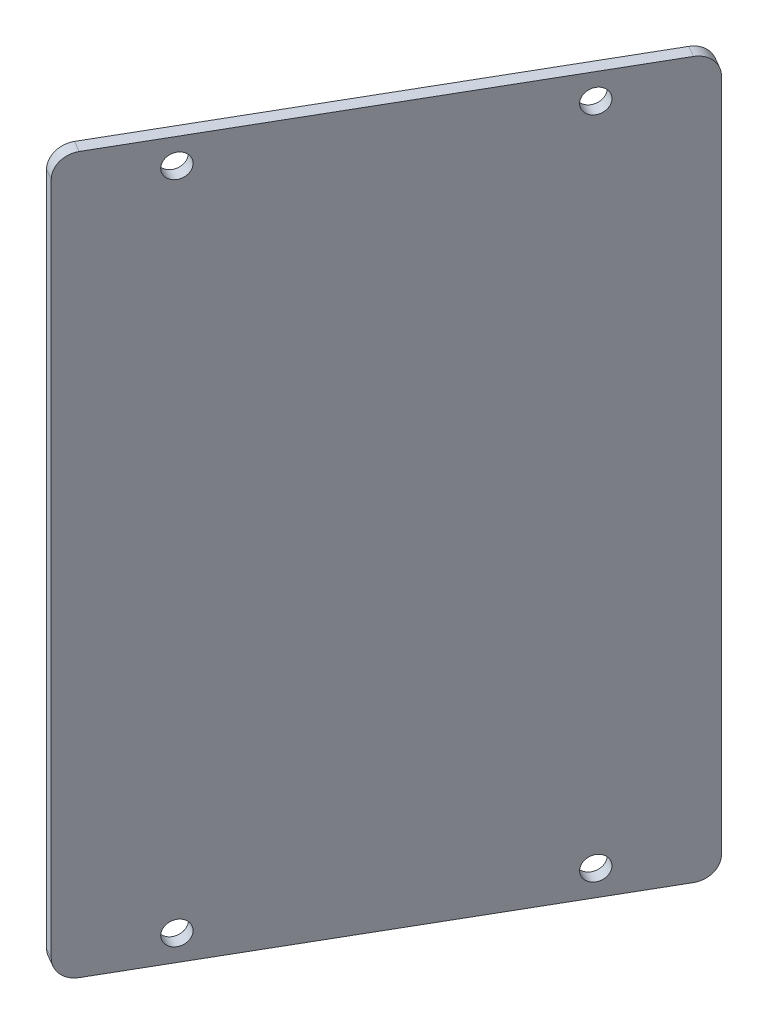
ISO-10303-21;
HEADER;
FILE_DESCRIPTION(('STEP AP214'),'2;1');
FILE_NAME('part.step','',(''),(''),'','','');
FILE_SCHEMA(('AUTOMOTIVE_DESIGN { 1 0 10303 214 1 1 1 1 }'));
ENDSEC;
DATA;
#1=APPLICATION_CONTEXT('core data for automotive mechanical design processes');
#2=APPLICATION_PROTOCOL_DEFINITION('international standard','automotive_design',2000,#1);
#3=PRODUCT_CONTEXT('',#1,'mechanical');
#4=PRODUCT('Part','Part','',(#3));
#5=PRODUCT_RELATED_PRODUCT_CATEGORY('part','',(#4));
#6=PRODUCT_DEFINITION_FORMATION('','',#4);
#7=PRODUCT_DEFINITION_CONTEXT('part definition',#1,'design');
#8=PRODUCT_DEFINITION('design','',#6,#7);
#9=PRODUCT_DEFINITION_SHAPE('','',#8);
#10=(LENGTH_UNIT() NAMED_UNIT(*) SI_UNIT(.MILLI.,.METRE.));
#11=(NAMED_UNIT(*) PLANE_ANGLE_UNIT() SI_UNIT($,.RADIAN.));
#12=(NAMED_UNIT(*) SI_UNIT($,.STERADIAN.) SOLID_ANGLE_UNIT());
#13=UNCERTAINTY_MEASURE_WITH_UNIT(LENGTH_MEASURE(1.E-05),#10,'distance_accuracy_value','');
#14=(GEOMETRIC_REPRESENTATION_CONTEXT(3) GLOBAL_UNCERTAINTY_ASSIGNED_CONTEXT((#13)) GLOBAL_UNIT_ASSIGNED_CONTEXT((#10,
#11,#12)) REPRESENTATION_CONTEXT('',''));
#15=CARTESIAN_POINT('',(0.,0.,0.));
#16=DIRECTION('',(0.,0.,1.));
#17=DIRECTION('',(1.,0.,0.));
#18=AXIS2_PLACEMENT_3D('',#15,#16,#17);
#19=CARTESIAN_POINT('',(-5.38222992761699,0.,-38.3027043073497));
#20=DIRECTION('',(0.5,0.,-0.866025403784439));
#21=DIRECTION('',(-0.866025403784439,0.,-0.5));
#22=AXIS2_PLACEMENT_3D('',#19,#20,#21);
#23=PLANE('',#22);
#24=DIRECTION('',(0.,1.,0.));
#25=VECTOR('',#24,1.);
#26=CARTESIAN_POINT('',(-4.00741459910919,0.,-37.5089543073497));
#27=LINE('',#26,#25);
#28=CARTESIAN_POINT('',(-4.00741459910919,2.54,-37.5089543073497));
#29=VERTEX_POINT('',#28);
#30=CARTESIAN_POINT('',(-4.00741459910919,86.36,-37.5089543073497));
#31=VERTEX_POINT('',#30);
#32=EDGE_CURVE('E165',#29,#31,#27,.T.);
#33=ORIENTED_EDGE('',*,*,#32,.F.);
#34=DIRECTION('',(0.866025403784439,0.,0.5));
#35=VECTOR('',#34,1.);
#36=CARTESIAN_POINT('',(-5.38222992761699,2.54,-38.3027043073497));
#37=LINE('',#36,#35);
#38=CARTESIAN_POINT('',(-5.38222992761699,2.54,-38.3027043073497));
#39=VERTEX_POINT('',#38);
#40=EDGE_CURVE('E11',#39,#29,#37,.T.);
#41=ORIENTED_EDGE('',*,*,#40,.F.);
#42=DIRECTION('',(0.,1.,0.));
#43=VECTOR('',#42,1.);
#44=CARTESIAN_POINT('',(-5.38222992761699,0.,-38.3027043073497));
#45=LINE('',#44,#43);
#46=CARTESIAN_POINT('',(-5.38222992761699,86.36,-38.3027043073497));
#47=VERTEX_POINT('',#46);
#48=EDGE_CURVE('E194',#39,#47,#45,.T.);
#49=ORIENTED_EDGE('',*,*,#48,.T.);
#50=DIRECTION('',(0.866025403784439,0.,0.5));
#51=VECTOR('',#50,1.);
#52=CARTESIAN_POINT('',(-5.38222992761699,86.36,-38.3027043073497));
#53=LINE('',#52,#51);
#54=EDGE_CURVE('E116',#47,#31,#53,.T.);
#55=ORIENTED_EDGE('',*,*,#54,.T.);
#56=EDGE_LOOP('',(#33,#41,#49,#55));
#57=FACE_BOUND('',#56,.T.);
#58=ADVANCED_FACE('F49',(#57),#23,.T.);
#59=CARTESIAN_POINT('',(-6.65222992761698,2.54,-36.1029997817372));
#60=DIRECTION('',(0.866025403784439,0.,0.5));
#61=DIRECTION('',(0.5,0.,-0.866025403784439));
#62=AXIS2_PLACEMENT_3D('',#59,#60,#61);
#63=CYLINDRICAL_SURFACE('',#62,2.54);
#64=CARTESIAN_POINT('',(-5.27741459910919,2.54,-35.3092497817372));
#65=DIRECTION('',(0.866025403784439,0.,0.5));
#66=DIRECTION('',(0.5,0.,-0.866025403784439));
#67=AXIS2_PLACEMENT_3D('',#64,#65,#66);
#68=CIRCLE('',#67,2.54);
#69=CARTESIAN_POINT('',(-5.27741459910919,0.,-35.3092497817372));
#70=VERTEX_POINT('',#69);
#71=EDGE_CURVE('E191',#70,#29,#68,.T.);
#72=ORIENTED_EDGE('',*,*,#71,.F.);
#73=DIRECTION('',(0.866025403784439,0.,0.5));
#74=VECTOR('',#73,1.);
#75=CARTESIAN_POINT('',(-6.65222992761699,0.,-36.1029997817372));
#76=LINE('',#75,#74);
#77=CARTESIAN_POINT('',(-6.65222992761699,0.,-36.1029997817372));
#78=VERTEX_POINT('',#77);
#79=EDGE_CURVE('E59',#78,#70,#76,.T.);
#80=ORIENTED_EDGE('',*,*,#79,.F.);
#81=CARTESIAN_POINT('',(-6.65222992761698,2.54,-36.1029997817372));
#82=DIRECTION('',(0.866025403784439,0.,0.5));
#83=DIRECTION('',(0.5,0.,-0.866025403784439));
#84=AXIS2_PLACEMENT_3D('',#81,#82,#83);
#85=CIRCLE('',#84,2.54);
#86=EDGE_CURVE('E142',#78,#39,#85,.T.);
#87=ORIENTED_EDGE('',*,*,#86,.T.);
#88=ORIENTED_EDGE('',*,*,#40,.T.);
#89=EDGE_LOOP('',(#72,#80,#87,#88));
#90=FACE_BOUND('',#89,.T.);
#91=ADVANCED_FACE('F213',(#90),#63,.T.);
#92=CARTESIAN_POINT('',(-20.622229927617,0.,-11.90625));
#93=DIRECTION('',(0.,1.,0.));
#94=DIRECTION('',(-1.,0.,0.));
#95=AXIS2_PLACEMENT_3D('',#92,#93,#94);
#96=PLANE('',#95);
#97=DIRECTION('',(-0.5,0.,0.866025403784439));
#98=VECTOR('',#97,1.);
#99=CARTESIAN_POINT('',(-19.2474145991092,0.,-11.1125));
#100=LINE('',#99,#98);
#101=CARTESIAN_POINT('',(-33.2174145991092,0.,13.0842497817372));
#102=VERTEX_POINT('',#101);
#103=EDGE_CURVE('E147',#70,#102,#100,.T.);
#104=ORIENTED_EDGE('',*,*,#103,.T.);
#105=DIRECTION('',(0.866025403784439,0.,0.5));
#106=VECTOR('',#105,1.);
#107=CARTESIAN_POINT('',(-34.592229927617,0.,12.2904997817372));
#108=LINE('',#107,#106);
#109=CARTESIAN_POINT('',(-34.592229927617,0.,12.2904997817372));
#110=VERTEX_POINT('',#109);
#111=EDGE_CURVE('E145',#110,#102,#108,.T.);
#112=ORIENTED_EDGE('',*,*,#111,.F.);
#113=DIRECTION('',(-0.5,0.,0.866025403784439));
#114=VECTOR('',#113,1.);
#115=CARTESIAN_POINT('',(-20.622229927617,0.,-11.90625));
#116=LINE('',#115,#114);
#117=EDGE_CURVE('E135',#78,#110,#116,.T.);
#118=ORIENTED_EDGE('',*,*,#117,.F.);
#119=ORIENTED_EDGE('',*,*,#79,.T.);
#120=EDGE_LOOP('',(#104,#112,#118,#119));
#121=FACE_BOUND('',#120,.T.);
#122=ADVANCED_FACE('F146',(#121),#96,.F.);
#123=CARTESIAN_POINT('',(-34.592229927617,2.53999999999999,12.2904997817372));
#124=DIRECTION('',(0.866025403784439,0.,0.5));
#125=DIRECTION('',(0.5,0.,-0.866025403784439));
#126=AXIS2_PLACEMENT_3D('',#123,#124,#125);
#127=CYLINDRICAL_SURFACE('',#126,2.54);
#128=CARTESIAN_POINT('',(-33.2174145991092,2.53999999999999,13.0842497817372));
#129=DIRECTION('',(0.866025403784439,0.,0.5));
#130=DIRECTION('',(0.5,0.,-0.866025403784439));
#131=AXIS2_PLACEMENT_3D('',#128,#129,#130);
#132=CIRCLE('',#131,2.54);
#133=CARTESIAN_POINT('',(-34.4874145991092,2.53999999999999,15.2839543073497));
#134=VERTEX_POINT('',#133);
#135=EDGE_CURVE('E186',#134,#102,#132,.T.);
#136=ORIENTED_EDGE('',*,*,#135,.F.);
#137=DIRECTION('',(0.866025403784439,0.,0.5));
#138=VECTOR('',#137,1.);
#139=CARTESIAN_POINT('',(-35.862229927617,2.53999999999999,14.4902043073497));
#140=LINE('',#139,#138);
#141=CARTESIAN_POINT('',(-35.862229927617,2.53999999999999,14.4902043073497));
#142=VERTEX_POINT('',#141);
#143=EDGE_CURVE('E152',#142,#134,#140,.T.);
#144=ORIENTED_EDGE('',*,*,#143,.F.);
#145=CARTESIAN_POINT('',(-34.592229927617,2.53999999999999,12.2904997817372));
#146=DIRECTION('',(0.866025403784439,0.,0.5));
#147=DIRECTION('',(0.5,0.,-0.866025403784439));
#148=AXIS2_PLACEMENT_3D('',#145,#146,#147);
#149=CIRCLE('',#148,2.54);
#150=EDGE_CURVE('E140',#142,#110,#149,.T.);
#151=ORIENTED_EDGE('',*,*,#150,.T.);
#152=ORIENTED_EDGE('',*,*,#111,.T.);
#153=EDGE_LOOP('',(#136,#144,#151,#152));
#154=FACE_BOUND('',#153,.T.);
#155=ADVANCED_FACE('F154',(#154),#127,.T.);
#156=CARTESIAN_POINT('',(-35.862229927617,0.,14.4902043073497));
#157=DIRECTION('',(-0.5,0.,0.866025403784439));
#158=DIRECTION('',(0.866025403784439,0.,0.5));
#159=AXIS2_PLACEMENT_3D('',#156,#157,#158);
#160=PLANE('',#159);
#161=DIRECTION('',(0.,-1.,0.));
#162=VECTOR('',#161,1.);
#163=CARTESIAN_POINT('',(-34.4874145991092,0.,15.2839543073497));
#164=LINE('',#163,#162);
#165=CARTESIAN_POINT('',(-34.4874145991092,86.36,15.2839543073497));
#166=VERTEX_POINT('',#165);
#167=EDGE_CURVE('E182',#166,#134,#164,.T.);
#168=ORIENTED_EDGE('',*,*,#167,.F.);
#169=DIRECTION('',(0.866025403784439,0.,0.5));
#170=VECTOR('',#169,1.);
#171=CARTESIAN_POINT('',(-35.862229927617,86.36,14.4902043073497));
#172=LINE('',#171,#170);
#173=CARTESIAN_POINT('',(-35.862229927617,86.36,14.4902043073497));
#174=VERTEX_POINT('',#173);
#175=EDGE_CURVE('E200',#174,#166,#172,.T.);
#176=ORIENTED_EDGE('',*,*,#175,.F.);
#177=DIRECTION('',(0.,-1.,0.));
#178=VECTOR('',#177,1.);
#179=CARTESIAN_POINT('',(-35.862229927617,0.,14.4902043073497));
#180=LINE('',#179,#178);
#181=EDGE_CURVE('E156',#174,#142,#180,.T.);
#182=ORIENTED_EDGE('',*,*,#181,.T.);
#183=ORIENTED_EDGE('',*,*,#143,.T.);
#184=EDGE_LOOP('',(#168,#176,#182,#183));
#185=FACE_BOUND('',#184,.T.);
#186=ADVANCED_FACE('F226',(#185),#160,.T.);
#187=CARTESIAN_POINT('',(-34.592229927617,86.36,12.2904997817372));
#188=DIRECTION('',(0.866025403784439,0.,0.5));
#189=DIRECTION('',(0.5,0.,-0.866025403784439));
#190=AXIS2_PLACEMENT_3D('',#187,#188,#189);
#191=CYLINDRICAL_SURFACE('',#190,2.54000000000001);
#192=CARTESIAN_POINT('',(-33.2174145991092,86.36,13.0842497817372));
#193=DIRECTION('',(0.866025403784439,0.,0.5));
#194=DIRECTION('',(0.5,0.,-0.866025403784439));
#195=AXIS2_PLACEMENT_3D('',#192,#193,#194);
#196=CIRCLE('',#195,2.54000000000001);
#197=CARTESIAN_POINT('',(-33.2174145991092,88.9,13.0842497817372));
#198=VERTEX_POINT('',#197);
#199=EDGE_CURVE('E178',#198,#166,#196,.T.);
#200=ORIENTED_EDGE('',*,*,#199,.F.);
#201=DIRECTION('',(0.866025403784439,0.,0.5));
#202=VECTOR('',#201,1.);
#203=CARTESIAN_POINT('',(-34.592229927617,88.9,12.2904997817372));
#204=LINE('',#203,#202);
#205=CARTESIAN_POINT('',(-34.592229927617,88.9,12.2904997817372));
#206=VERTEX_POINT('',#205);
#207=EDGE_CURVE('E203',#206,#198,#204,.T.);
#208=ORIENTED_EDGE('',*,*,#207,.F.);
#209=CARTESIAN_POINT('',(-34.592229927617,86.36,12.2904997817372));
#210=DIRECTION('',(0.866025403784439,0.,0.5));
#211=DIRECTION('',(0.5,0.,-0.866025403784439));
#212=AXIS2_PLACEMENT_3D('',#209,#210,#211);
#213=CIRCLE('',#212,2.54000000000001);
#214=EDGE_CURVE('E159',#206,#174,#213,.T.);
#215=ORIENTED_EDGE('',*,*,#214,.T.);
#216=ORIENTED_EDGE('',*,*,#175,.T.);
#217=EDGE_LOOP('',(#200,#208,#215,#216));
#218=FACE_BOUND('',#217,.T.);
#219=ADVANCED_FACE('F229',(#218),#191,.T.);
#220=CARTESIAN_POINT('',(-20.6222299276169,88.9,-11.9062500000001));
#221=DIRECTION('',(0.,1.,0.));
#222=DIRECTION('',(0.,0.,1.));
#223=AXIS2_PLACEMENT_3D('',#220,#221,#222);
#224=PLANE('',#223);
#225=DIRECTION('',(-0.5,0.,0.866025403784439));
#226=VECTOR('',#225,1.);
#227=CARTESIAN_POINT('',(-19.2474145991092,88.9,-11.1125000000001));
#228=LINE('',#227,#226);
#229=CARTESIAN_POINT('',(-5.2774145991092,88.9,-35.3092497817372));
#230=VERTEX_POINT('',#229);
#231=EDGE_CURVE('E174',#230,#198,#228,.T.);
#232=ORIENTED_EDGE('',*,*,#231,.F.);
#233=DIRECTION('',(0.866025403784439,0.,0.5));
#234=VECTOR('',#233,1.);
#235=CARTESIAN_POINT('',(-6.652229927617,88.9,-36.1029997817372));
#236=LINE('',#235,#234);
#237=CARTESIAN_POINT('',(-6.652229927617,88.9,-36.1029997817372));
#238=VERTEX_POINT('',#237);
#239=EDGE_CURVE('E206',#238,#230,#236,.T.);
#240=ORIENTED_EDGE('',*,*,#239,.F.);
#241=DIRECTION('',(-0.5,0.,0.866025403784439));
#242=VECTOR('',#241,1.);
#243=CARTESIAN_POINT('',(-20.6222299276169,88.9,-11.9062500000001));
#244=LINE('',#243,#242);
#245=EDGE_CURVE('E301',#238,#206,#244,.T.);
#246=ORIENTED_EDGE('',*,*,#245,.T.);
#247=ORIENTED_EDGE('',*,*,#207,.T.);
#248=EDGE_LOOP('',(#232,#240,#246,#247));
#249=FACE_BOUND('',#248,.T.);
#250=ADVANCED_FACE('F233',(#249),#224,.T.);
#251=CARTESIAN_POINT('',(-6.652229927617,86.36,-36.1029997817372));
#252=DIRECTION('',(0.866025403784439,0.,0.5));
#253=DIRECTION('',(0.5,0.,-0.866025403784439));
#254=AXIS2_PLACEMENT_3D('',#251,#252,#253);
#255=CYLINDRICAL_SURFACE('',#254,2.54);
#256=CARTESIAN_POINT('',(-5.2774145991092,86.36,-35.3092497817372));
#257=DIRECTION('',(0.866025403784439,0.,0.5));
#258=DIRECTION('',(0.5,0.,-0.866025403784439));
#259=AXIS2_PLACEMENT_3D('',#256,#257,#258);
#260=CIRCLE('',#259,2.54);
#261=EDGE_CURVE('E169',#31,#230,#260,.T.);
#262=ORIENTED_EDGE('',*,*,#261,.F.);
#263=ORIENTED_EDGE('',*,*,#54,.F.);
#264=CARTESIAN_POINT('',(-6.652229927617,86.36,-36.1029997817372));
#265=DIRECTION('',(0.866025403784439,0.,0.5));
#266=DIRECTION('',(0.5,0.,-0.866025403784439));
#267=AXIS2_PLACEMENT_3D('',#264,#265,#266);
#268=CIRCLE('',#267,2.54);
#269=EDGE_CURVE('E298',#47,#238,#268,.T.);
#270=ORIENTED_EDGE('',*,*,#269,.T.);
#271=ORIENTED_EDGE('',*,*,#239,.T.);
#272=EDGE_LOOP('',(#262,#263,#270,#271));
#273=FACE_BOUND('',#272,.T.);
#274=ADVANCED_FACE('F209',(#273),#255,.T.);
#275=CARTESIAN_POINT('',(-20.622229927617,0.,-11.90625));
#276=DIRECTION('',(0.866025403784439,0.,0.5));
#277=DIRECTION('',(0.5,0.,-0.866025403784439));
#278=AXIS2_PLACEMENT_3D('',#275,#276,#277);
#279=PLANE('',#278);
#280=CARTESIAN_POINT('',(-11.097229927617,85.725,-28.4040339420936));
#281=DIRECTION('',(-0.866025403784438,0.,-0.5));
#282=DIRECTION('',(-0.5,0.,0.866025403784439));
#283=AXIS2_PLACEMENT_3D('',#280,#281,#282);
#284=CIRCLE('',#283,1.47319999999999);
#285=CARTESIAN_POINT('',(-11.833829927617,85.725,-27.1282053172383));
#286=VERTEX_POINT('',#285);
#287=EDGE_CURVE('E271',#286,#286,#284,.T.);
#288=ORIENTED_EDGE('',*,*,#287,.F.);
#289=EDGE_LOOP('',(#288));
#290=FACE_BOUND('',#289,.T.);
#291=CARTESIAN_POINT('',(-30.147229927617,85.725,4.59153394209356));
#292=DIRECTION('',(-0.866025403784438,0.,-0.5));
#293=DIRECTION('',(-0.5,0.,0.866025403784439));
#294=AXIS2_PLACEMENT_3D('',#291,#292,#293);
#295=CIRCLE('',#294,1.47319999999999);
#296=CARTESIAN_POINT('',(-30.883829927617,85.725,5.86736256694879));
#297=VERTEX_POINT('',#296);
#298=EDGE_CURVE('E275',#297,#297,#295,.T.);
#299=ORIENTED_EDGE('',*,*,#298,.F.);
#300=EDGE_LOOP('',(#299));
#301=FACE_BOUND('',#300,.T.);
#302=CARTESIAN_POINT('',(-30.147229927617,3.175,4.59153394209356));
#303=DIRECTION('',(-0.866025403784438,0.,-0.5));
#304=DIRECTION('',(-0.5,0.,0.866025403784439));
#305=AXIS2_PLACEMENT_3D('',#302,#303,#304);
#306=CIRCLE('',#305,1.4732);
#307=CARTESIAN_POINT('',(-30.883829927617,3.175,5.86736256694879));
#308=VERTEX_POINT('',#307);
#309=EDGE_CURVE('E281',#308,#308,#306,.T.);
#310=ORIENTED_EDGE('',*,*,#309,.F.);
#311=EDGE_LOOP('',(#310));
#312=FACE_BOUND('',#311,.T.);
#313=CARTESIAN_POINT('',(-11.097229927617,3.175,-28.4040339420936));
#314=DIRECTION('',(-0.866025403784438,0.,-0.5));
#315=DIRECTION('',(-0.5,0.,0.866025403784439));
#316=AXIS2_PLACEMENT_3D('',#313,#314,#315);
#317=CIRCLE('',#316,1.4732);
#318=CARTESIAN_POINT('',(-11.833829927617,3.175,-27.1282053172383));
#319=VERTEX_POINT('',#318);
#320=EDGE_CURVE('E289',#319,#319,#317,.T.);
#321=ORIENTED_EDGE('',*,*,#320,.F.);
#322=EDGE_LOOP('',(#321));
#323=FACE_BOUND('',#322,.T.);
#324=ORIENTED_EDGE('',*,*,#48,.F.);
#325=ORIENTED_EDGE('',*,*,#86,.F.);
#326=ORIENTED_EDGE('',*,*,#117,.T.);
#327=ORIENTED_EDGE('',*,*,#150,.F.);
#328=ORIENTED_EDGE('',*,*,#181,.F.);
#329=ORIENTED_EDGE('',*,*,#214,.F.);
#330=ORIENTED_EDGE('',*,*,#245,.F.);
#331=ORIENTED_EDGE('',*,*,#269,.F.);
#332=EDGE_LOOP('',(#324,#325,#326,#327,#328,#329,#330,#331));
#333=FACE_BOUND('',#332,.T.);
#334=ADVANCED_FACE('F137',(#290,#301,#312,#323,#333),#279,.F.);
#335=CARTESIAN_POINT('',(-19.2474145991092,0.,-11.1125));
#336=DIRECTION('',(0.866025403784439,0.,0.5));
#337=DIRECTION('',(0.5,0.,-0.866025403784439));
#338=AXIS2_PLACEMENT_3D('',#335,#336,#337);
#339=PLANE('',#338);
#340=CARTESIAN_POINT('',(-9.72241459910918,85.725,-27.6102839420936));
#341=DIRECTION('',(0.866025403784439,0.,0.5));
#342=DIRECTION('',(0.5,0.,-0.866025403784439));
#343=AXIS2_PLACEMENT_3D('',#340,#341,#342);
#344=CIRCLE('',#343,1.47319999999999);
#345=CARTESIAN_POINT('',(-10.4590145991092,85.725,-26.3344553172383));
#346=VERTEX_POINT('',#345);
#347=EDGE_CURVE('E269',#346,#346,#344,.T.);
#348=ORIENTED_EDGE('',*,*,#347,.F.);
#349=EDGE_LOOP('',(#348));
#350=FACE_BOUND('',#349,.T.);
#351=CARTESIAN_POINT('',(-28.7724145991092,85.725,5.38528394209356));
#352=DIRECTION('',(0.866025403784439,0.,0.5));
#353=DIRECTION('',(0.5,0.,-0.866025403784439));
#354=AXIS2_PLACEMENT_3D('',#351,#352,#353);
#355=CIRCLE('',#354,1.47319999999999);
#356=CARTESIAN_POINT('',(-29.5090145991092,85.725,6.66111256694879));
#357=VERTEX_POINT('',#356);
#358=EDGE_CURVE('E52',#357,#357,#355,.T.);
#359=ORIENTED_EDGE('',*,*,#358,.F.);
#360=EDGE_LOOP('',(#359));
#361=FACE_BOUND('',#360,.T.);
#362=CARTESIAN_POINT('',(-28.7724145991092,3.175,5.38528394209356));
#363=DIRECTION('',(0.866025403784439,0.,0.5));
#364=DIRECTION('',(0.5,0.,-0.866025403784439));
#365=AXIS2_PLACEMENT_3D('',#362,#363,#364);
#366=CIRCLE('',#365,1.47319999999999);
#367=CARTESIAN_POINT('',(-29.5090145991092,3.175,6.66111256694879));
#368=VERTEX_POINT('',#367);
#369=EDGE_CURVE('E285',#368,#368,#366,.T.);
#370=ORIENTED_EDGE('',*,*,#369,.F.);
#371=EDGE_LOOP('',(#370));
#372=FACE_BOUND('',#371,.T.);
#373=CARTESIAN_POINT('',(-9.72241459910918,3.175,-27.6102839420936));
#374=DIRECTION('',(0.866025403784439,0.,0.5));
#375=DIRECTION('',(0.5,0.,-0.866025403784439));
#376=AXIS2_PLACEMENT_3D('',#373,#374,#375);
#377=CIRCLE('',#376,1.47319999999999);
#378=CARTESIAN_POINT('',(-10.4590145991092,3.175,-26.3344553172383));
#379=VERTEX_POINT('',#378);
#380=EDGE_CURVE('E170',#379,#379,#377,.T.);
#381=ORIENTED_EDGE('',*,*,#380,.F.);
#382=EDGE_LOOP('',(#381));
#383=FACE_BOUND('',#382,.T.);
#384=ORIENTED_EDGE('',*,*,#32,.T.);
#385=ORIENTED_EDGE('',*,*,#261,.T.);
#386=ORIENTED_EDGE('',*,*,#231,.T.);
#387=ORIENTED_EDGE('',*,*,#199,.T.);
#388=ORIENTED_EDGE('',*,*,#167,.T.);
#389=ORIENTED_EDGE('',*,*,#135,.T.);
#390=ORIENTED_EDGE('',*,*,#103,.F.);
#391=ORIENTED_EDGE('',*,*,#71,.T.);
#392=EDGE_LOOP('',(#384,#385,#386,#387,#388,#389,#390,#391));
#393=FACE_BOUND('',#392,.T.);
#394=ADVANCED_FACE('F212',(#350,#361,#372,#383,#393),#339,.T.);
#395=CARTESIAN_POINT('',(-11.097229927617,3.175,-28.4040339420936));
#396=DIRECTION('',(-0.866025403784438,0.,-0.5));
#397=DIRECTION('',(-0.5,0.,0.866025403784439));
#398=AXIS2_PLACEMENT_3D('',#395,#396,#397);
#399=CYLINDRICAL_SURFACE('',#398,1.47319999999999);
#400=CARTESIAN_POINT('',(-10.4590145991092,3.175,-26.3344553172383));
#401=CARTESIAN_POINT('',(-10.4733355921145,3.175,-26.342723546405));
#402=CARTESIAN_POINT('',(-10.4876565851198,3.175,-26.3509917755717));
#403=CARTESIAN_POINT('',(-10.5162985711303,3.175,-26.367528233905));
#404=CARTESIAN_POINT('',(-10.5306195641356,3.175,-26.3757964630717));
#405=CARTESIAN_POINT('',(-10.5592615501462,3.175,-26.392332921405));
#406=CARTESIAN_POINT('',(-10.5735825431515,3.175,-26.4006011505717));
#407=CARTESIAN_POINT('',(-10.6022245291621,3.175,-26.417137608905));
#408=CARTESIAN_POINT('',(-10.6165455221674,3.175,-26.4254058380717));
#409=CARTESIAN_POINT('',(-10.6451875081779,3.175,-26.441942296405));
#410=CARTESIAN_POINT('',(-10.6595085011832,3.175,-26.4502105255717));
#411=CARTESIAN_POINT('',(-10.6881504871938,3.175,-26.466746983905));
#412=CARTESIAN_POINT('',(-10.7024714801991,3.175,-26.4750152130717));
#413=CARTESIAN_POINT('',(-10.7311134662097,3.175,-26.491551671405));
#414=CARTESIAN_POINT('',(-10.745434459215,3.175,-26.4998199005717));
#415=CARTESIAN_POINT('',(-10.7740764452255,3.175,-26.516356358905));
#416=CARTESIAN_POINT('',(-10.7883974382308,3.175,-26.5246245880717));
#417=CARTESIAN_POINT('',(-10.8170394242414,3.175,-26.541161046405));
#418=CARTESIAN_POINT('',(-10.8313604172467,3.175,-26.5494292755717));
#419=CARTESIAN_POINT('',(-10.8600024032573,3.175,-26.565965733905));
#420=CARTESIAN_POINT('',(-10.8743233962626,3.175,-26.5742339630717));
#421=CARTESIAN_POINT('',(-10.9029653822732,3.175,-26.590770421405));
#422=CARTESIAN_POINT('',(-10.9172863752784,3.175,-26.5990386505717));
#423=CARTESIAN_POINT('',(-10.945928361289,3.175,-26.615575108905));
#424=CARTESIAN_POINT('',(-10.9602493542943,3.175,-26.6238433380717));
#425=CARTESIAN_POINT('',(-10.9888913403049,3.175,-26.640379796405));
#426=CARTESIAN_POINT('',(-11.0032123333102,3.175,-26.6486480255717));
#427=CARTESIAN_POINT('',(-11.0318543193208,3.175,-26.665184483905));
#428=CARTESIAN_POINT('',(-11.0461753123261,3.175,-26.6734527130717));
#429=CARTESIAN_POINT('',(-11.0748172983366,3.175,-26.689989171405));
#430=CARTESIAN_POINT('',(-11.0891382913419,3.175,-26.6982574005717));
#431=CARTESIAN_POINT('',(-11.1177802773525,3.175,-26.714793858905));
#432=CARTESIAN_POINT('',(-11.1321012703578,3.175,-26.7230620880717));
#433=CARTESIAN_POINT('',(-11.1607432563684,3.175,-26.739598546405));
#434=CARTESIAN_POINT('',(-11.1750642493737,3.175,-26.7478667755717));
#435=CARTESIAN_POINT('',(-11.2037062353842,3.175,-26.764403233905));
#436=CARTESIAN_POINT('',(-11.2180272283895,3.175,-26.7726714630717));
#437=CARTESIAN_POINT('',(-11.2466692144001,3.175,-26.789207921405));
#438=CARTESIAN_POINT('',(-11.2609902074054,3.175,-26.7974761505717));
#439=CARTESIAN_POINT('',(-11.289632193416,3.175,-26.814012608905));
#440=CARTESIAN_POINT('',(-11.3039531864213,3.175,-26.8222808380717));
#441=CARTESIAN_POINT('',(-11.3325951724318,3.175,-26.838817296405));
#442=CARTESIAN_POINT('',(-11.3469161654371,3.175,-26.8470855255717));
#443=CARTESIAN_POINT('',(-11.3755581514477,3.175,-26.863621983905));
#444=CARTESIAN_POINT('',(-11.389879144453,3.175,-26.8718902130717));
#445=CARTESIAN_POINT('',(-11.4185211304636,3.175,-26.888426671405));
#446=CARTESIAN_POINT('',(-11.4328421234689,3.175,-26.8966949005717));
#447=CARTESIAN_POINT('',(-11.4614841094794,3.175,-26.913231358905));
#448=CARTESIAN_POINT('',(-11.4758051024847,3.175,-26.9214995880717));
#449=CARTESIAN_POINT('',(-11.5044470884953,3.175,-26.938036046405));
#450=CARTESIAN_POINT('',(-11.5187680815006,3.175,-26.9463042755717));
#451=CARTESIAN_POINT('',(-11.5474100675112,3.175,-26.962840733905));
#452=CARTESIAN_POINT('',(-11.5617310605165,3.175,-26.9711089630717));
#453=CARTESIAN_POINT('',(-11.5903730465271,3.175,-26.987645421405));
#454=CARTESIAN_POINT('',(-11.6046940395323,3.175,-26.9959136505717));
#455=CARTESIAN_POINT('',(-11.6333360255429,3.175,-27.012450108905));
#456=CARTESIAN_POINT('',(-11.6476570185482,3.175,-27.0207183380717));
#457=CARTESIAN_POINT('',(-11.6762990045588,3.175,-27.037254796405));
#458=CARTESIAN_POINT('',(-11.6906199975641,3.175,-27.0455230255717));
#459=CARTESIAN_POINT('',(-11.7192619835747,3.175,-27.062059483905));
#460=CARTESIAN_POINT('',(-11.7335829765799,3.175,-27.0703277130717));
#461=CARTESIAN_POINT('',(-11.7622249625905,3.175,-27.086864171405));
#462=CARTESIAN_POINT('',(-11.7765459555958,3.175,-27.0951324005717));
#463=CARTESIAN_POINT('',(-11.8051879416064,3.175,-27.111668858905));
#464=CARTESIAN_POINT('',(-11.8195089346117,3.175,-27.1199370880717));
#465=CARTESIAN_POINT('',(-11.833829927617,3.175,-27.1282053172383));
#466=B_SPLINE_CURVE_WITH_KNOTS('',3,(#400,#401,#402,#403,#404,#405,#406,#407,#408,#409,#410,
#411,#412,#413,#414,#415,#416,#417,#418,#419,#420,#421,#422,#423,#424,#425,#426,#427,#428,#429,
#430,#431,#432,#433,#434,#435,#436,#437,#438,#439,#440,#441,#442,#443,#444,#445,#446,#447,#448,
#449,#450,#451,#452,#453,#454,#455,#456,#457,#458,#459,#460,#461,#462,#463,#464,#465),
.UNSPECIFIED.,.F.,.F.,(4,2,2,2,2,2,2,2,2,2,2,2,2,2,2,2,2,2,2,2,2,2,2,2,2,2,2,2,2,2,2,2,4),(0.,
0.0496093749999976,0.0992187499999984,0.148828124999999,0.198437499999998,0.248046874999999,
0.29765625,0.347265624999999,0.396874999999998,0.446484374999999,0.496093749999998,
0.545703124999999,0.5953125,0.644921874999999,0.694531249999998,0.744140624999999,
0.793749999999998,0.843359374999999,0.89296875,0.942578124999999,0.992187499999998,1.041796875,
1.09140625,1.141015625,1.190625,1.240234375,1.28984375,1.339453125,1.3890625,1.438671875,
1.48828125,1.537890625,1.5875),.UNSPECIFIED.);
#467=EDGE_CURVE('BSEAM245',#379,#319,#466,.T.);
#468=ORIENTED_EDGE('',*,*,#380,.T.);
#469=ORIENTED_EDGE('',*,*,#320,.T.);
#470=ORIENTED_EDGE('',*,*,#467,.T.);
#471=ORIENTED_EDGE('',*,*,#467,.F.);
#472=EDGE_LOOP('',(#468,#470,#469,#471));
#473=FACE_BOUND('',#472,.T.);
#474=ADVANCED_FACE('F245',(#473),#399,.F.);
#475=CARTESIAN_POINT('',(-30.147229927617,3.175,4.59153394209356));
#476=DIRECTION('',(-0.866025403784438,0.,-0.5));
#477=DIRECTION('',(-0.5,0.,0.866025403784439));
#478=AXIS2_PLACEMENT_3D('',#475,#476,#477);
#479=CYLINDRICAL_SURFACE('',#478,1.47319999999999);
#480=CARTESIAN_POINT('',(-29.5090145991092,3.175,6.66111256694879));
#481=CARTESIAN_POINT('',(-29.5233355921145,3.175,6.65284433778212));
#482=CARTESIAN_POINT('',(-29.5376565851198,3.175,6.64457610861545));
#483=CARTESIAN_POINT('',(-29.5662985711303,3.175,6.62803965028212));
#484=CARTESIAN_POINT('',(-29.5806195641356,3.175,6.61977142111545));
#485=CARTESIAN_POINT('',(-29.6092615501462,3.175,6.60323496278212));
#486=CARTESIAN_POINT('',(-29.6235825431515,3.175,6.59496673361545));
#487=CARTESIAN_POINT('',(-29.6522245291621,3.175,6.57843027528212));
#488=CARTESIAN_POINT('',(-29.6665455221674,3.175,6.57016204611545));
#489=CARTESIAN_POINT('',(-29.695187508178,3.175,6.55362558778212));
#490=CARTESIAN_POINT('',(-29.7095085011832,3.175,6.54535735861545));
#491=CARTESIAN_POINT('',(-29.7381504871938,3.175,6.52882090028212));
#492=CARTESIAN_POINT('',(-29.7524714801991,3.175,6.52055267111545));
#493=CARTESIAN_POINT('',(-29.7811134662097,3.175,6.50401621278212));
#494=CARTESIAN_POINT('',(-29.795434459215,3.175,6.49574798361545));
#495=CARTESIAN_POINT('',(-29.8240764452256,3.175,6.47921152528212));
#496=CARTESIAN_POINT('',(-29.8383974382308,3.175,6.47094329611545));
#497=CARTESIAN_POINT('',(-29.8670394242414,3.175,6.45440683778212));
#498=CARTESIAN_POINT('',(-29.8813604172467,3.175,6.44613860861545));
#499=CARTESIAN_POINT('',(-29.9100024032573,3.175,6.42960215028212));
#500=CARTESIAN_POINT('',(-29.9243233962626,3.175,6.42133392111545));
#501=CARTESIAN_POINT('',(-29.9529653822732,3.175,6.40479746278212));
#502=CARTESIAN_POINT('',(-29.9672863752785,3.175,6.39652923361545));
#503=CARTESIAN_POINT('',(-29.995928361289,3.175,6.37999277528212));
#504=CARTESIAN_POINT('',(-30.0102493542943,3.175,6.37172454611545));
#505=CARTESIAN_POINT('',(-30.0388913403049,3.175,6.35518808778212));
#506=CARTESIAN_POINT('',(-30.0532123333102,3.175,6.34691985861545));
#507=CARTESIAN_POINT('',(-30.0818543193208,3.175,6.33038340028212));
#508=CARTESIAN_POINT('',(-30.0961753123261,3.175,6.32211517111545));
#509=CARTESIAN_POINT('',(-30.1248172983366,3.175,6.30557871278212));
#510=CARTESIAN_POINT('',(-30.1391382913419,3.175,6.29731048361545));
#511=CARTESIAN_POINT('',(-30.1677802773525,3.175,6.28077402528212));
#512=CARTESIAN_POINT('',(-30.1821012703578,3.175,6.27250579611545));
#513=CARTESIAN_POINT('',(-30.2107432563684,3.175,6.25596933778212));
#514=CARTESIAN_POINT('',(-30.2250642493737,3.175,6.24770110861545));
#515=CARTESIAN_POINT('',(-30.2537062353843,3.175,6.23116465028212));
#516=CARTESIAN_POINT('',(-30.2680272283895,3.175,6.22289642111545));
#517=CARTESIAN_POINT('',(-30.2966692144001,3.175,6.20635996278212));
#518=CARTESIAN_POINT('',(-30.3109902074054,3.175,6.19809173361545));
#519=CARTESIAN_POINT('',(-30.339632193416,3.175,6.18155527528212));
#520=CARTESIAN_POINT('',(-30.3539531864213,3.175,6.17328704611545));
#521=CARTESIAN_POINT('',(-30.3825951724319,3.175,6.15675058778212));
#522=CARTESIAN_POINT('',(-30.3969161654371,3.175,6.14848235861545));
#523=CARTESIAN_POINT('',(-30.4255581514477,3.175,6.13194590028212));
#524=CARTESIAN_POINT('',(-30.439879144453,3.175,6.12367767111545));
#525=CARTESIAN_POINT('',(-30.4685211304636,3.175,6.10714121278212));
#526=CARTESIAN_POINT('',(-30.4828421234689,3.175,6.09887298361545));
#527=CARTESIAN_POINT('',(-30.5114841094795,3.175,6.08233652528212));
#528=CARTESIAN_POINT('',(-30.5258051024847,3.175,6.07406829611545));
#529=CARTESIAN_POINT('',(-30.5544470884953,3.175,6.05753183778212));
#530=CARTESIAN_POINT('',(-30.5687680815006,3.175,6.04926360861545));
#531=CARTESIAN_POINT('',(-30.5974100675112,3.175,6.03272715028212));
#532=CARTESIAN_POINT('',(-30.6117310605165,3.175,6.02445892111545));
#533=CARTESIAN_POINT('',(-30.6403730465271,3.175,6.00792246278212));
#534=CARTESIAN_POINT('',(-30.6546940395324,3.175,5.99965423361545));
#535=CARTESIAN_POINT('',(-30.6833360255429,3.175,5.98311777528212));
#536=CARTESIAN_POINT('',(-30.6976570185482,3.175,5.97484954611545));
#537=CARTESIAN_POINT('',(-30.7262990045588,3.175,5.95831308778212));
#538=CARTESIAN_POINT('',(-30.7406199975641,3.175,5.95004485861545));
#539=CARTESIAN_POINT('',(-30.7692619835747,3.175,5.93350840028212));
#540=CARTESIAN_POINT('',(-30.78358297658,3.175,5.92524017111545));
#541=CARTESIAN_POINT('',(-30.8122249625905,3.175,5.90870371278212));
#542=CARTESIAN_POINT('',(-30.8265459555958,3.175,5.90043548361545));
#543=CARTESIAN_POINT('',(-30.8551879416064,3.175,5.88389902528212));
#544=CARTESIAN_POINT('',(-30.8695089346117,3.175,5.87563079611546));
#545=CARTESIAN_POINT('',(-30.883829927617,3.175,5.86736256694879));
#546=B_SPLINE_CURVE_WITH_KNOTS('',3,(#480,#481,#482,#483,#484,#485,#486,#487,#488,#489,#490,
#491,#492,#493,#494,#495,#496,#497,#498,#499,#500,#501,#502,#503,#504,#505,#506,#507,#508,#509,
#510,#511,#512,#513,#514,#515,#516,#517,#518,#519,#520,#521,#522,#523,#524,#525,#526,#527,#528,
#529,#530,#531,#532,#533,#534,#535,#536,#537,#538,#539,#540,#541,#542,#543,#544,#545),
.UNSPECIFIED.,.F.,.F.,(4,2,2,2,2,2,2,2,2,2,2,2,2,2,2,2,2,2,2,2,2,2,2,2,2,2,2,2,2,2,2,2,4),(0.,
0.049609375,0.0992187500000004,0.148828125000001,0.198437500000001,0.248046875000001,
0.297656250000001,0.347265625000002,0.396875000000002,0.446484375000002,0.496093750000002,
0.545703125,0.5953125,0.644921875,0.69453125,0.744140625,0.793750000000001,0.843359375000001,
0.892968750000001,0.942578125000001,0.992187500000002,1.041796875,1.09140625,1.141015625,
1.190625,1.240234375,1.28984375,1.339453125,1.3890625,1.438671875,1.48828125,1.537890625,
1.5875),.UNSPECIFIED.);
#547=EDGE_CURVE('BSEAM252',#368,#308,#546,.T.);
#548=ORIENTED_EDGE('',*,*,#369,.T.);
#549=ORIENTED_EDGE('',*,*,#309,.T.);
#550=ORIENTED_EDGE('',*,*,#547,.T.);
#551=ORIENTED_EDGE('',*,*,#547,.F.);
#552=EDGE_LOOP('',(#548,#550,#549,#551));
#553=FACE_BOUND('',#552,.T.);
#554=ADVANCED_FACE('F252',(#553),#479,.F.);
#555=CARTESIAN_POINT('',(-30.147229927617,85.725,4.59153394209356));
#556=DIRECTION('',(-0.866025403784438,0.,-0.5));
#557=DIRECTION('',(-0.5,0.,0.866025403784439));
#558=AXIS2_PLACEMENT_3D('',#555,#556,#557);
#559=CYLINDRICAL_SURFACE('',#558,1.47319999999999);
#560=CARTESIAN_POINT('',(-29.5090145991092,85.725,6.66111256694879));
#561=CARTESIAN_POINT('',(-29.5233355921145,85.725,6.65284433778212));
#562=CARTESIAN_POINT('',(-29.5376565851198,85.725,6.64457610861545));
#563=CARTESIAN_POINT('',(-29.5662985711303,85.725,6.62803965028212));
#564=CARTESIAN_POINT('',(-29.5806195641356,85.725,6.61977142111545));
#565=CARTESIAN_POINT('',(-29.6092615501462,85.725,6.60323496278212));
#566=CARTESIAN_POINT('',(-29.6235825431515,85.725,6.59496673361545));
#567=CARTESIAN_POINT('',(-29.6522245291621,85.725,6.57843027528212));
#568=CARTESIAN_POINT('',(-29.6665455221674,85.725,6.57016204611546));
#569=CARTESIAN_POINT('',(-29.695187508178,85.725,6.55362558778212));
#570=CARTESIAN_POINT('',(-29.7095085011832,85.725,6.54535735861545));
#571=CARTESIAN_POINT('',(-29.7381504871938,85.725,6.52882090028212));
#572=CARTESIAN_POINT('',(-29.7524714801991,85.725,6.52055267111545));
#573=CARTESIAN_POINT('',(-29.7811134662097,85.725,6.50401621278212));
#574=CARTESIAN_POINT('',(-29.795434459215,85.725,6.49574798361546));
#575=CARTESIAN_POINT('',(-29.8240764452256,85.725,6.47921152528212));
#576=CARTESIAN_POINT('',(-29.8383974382308,85.725,6.47094329611545));
#577=CARTESIAN_POINT('',(-29.8670394242414,85.725,6.45440683778212));
#578=CARTESIAN_POINT('',(-29.8813604172467,85.725,6.44613860861545));
#579=CARTESIAN_POINT('',(-29.9100024032573,85.725,6.42960215028212));
#580=CARTESIAN_POINT('',(-29.9243233962626,85.725,6.42133392111545));
#581=CARTESIAN_POINT('',(-29.9529653822732,85.725,6.40479746278212));
#582=CARTESIAN_POINT('',(-29.9672863752785,85.725,6.39652923361546));
#583=CARTESIAN_POINT('',(-29.995928361289,85.725,6.37999277528212));
#584=CARTESIAN_POINT('',(-30.0102493542943,85.725,6.37172454611545));
#585=CARTESIAN_POINT('',(-30.0388913403049,85.725,6.35518808778212));
#586=CARTESIAN_POINT('',(-30.0532123333102,85.725,6.34691985861545));
#587=CARTESIAN_POINT('',(-30.0818543193208,85.725,6.33038340028212));
#588=CARTESIAN_POINT('',(-30.0961753123261,85.725,6.32211517111545));
#589=CARTESIAN_POINT('',(-30.1248172983366,85.725,6.30557871278212));
#590=CARTESIAN_POINT('',(-30.1391382913419,85.725,6.29731048361545));
#591=CARTESIAN_POINT('',(-30.1677802773525,85.725,6.28077402528212));
#592=CARTESIAN_POINT('',(-30.1821012703578,85.725,6.27250579611545));
#593=CARTESIAN_POINT('',(-30.2107432563684,85.725,6.25596933778212));
#594=CARTESIAN_POINT('',(-30.2250642493737,85.725,6.24770110861545));
#595=CARTESIAN_POINT('',(-30.2537062353843,85.725,6.23116465028212));
#596=CARTESIAN_POINT('',(-30.2680272283895,85.725,6.22289642111545));
#597=CARTESIAN_POINT('',(-30.2966692144001,85.725,6.20635996278212));
#598=CARTESIAN_POINT('',(-30.3109902074054,85.725,6.19809173361545));
#599=CARTESIAN_POINT('',(-30.339632193416,85.725,6.18155527528212));
#600=CARTESIAN_POINT('',(-30.3539531864213,85.725,6.17328704611545));
#601=CARTESIAN_POINT('',(-30.3825951724319,85.725,6.15675058778212));
#602=CARTESIAN_POINT('',(-30.3969161654371,85.725,6.14848235861545));
#603=CARTESIAN_POINT('',(-30.4255581514477,85.725,6.13194590028212));
#604=CARTESIAN_POINT('',(-30.439879144453,85.725,6.12367767111545));
#605=CARTESIAN_POINT('',(-30.4685211304636,85.725,6.10714121278212));
#606=CARTESIAN_POINT('',(-30.4828421234689,85.725,6.09887298361545));
#607=CARTESIAN_POINT('',(-30.5114841094795,85.725,6.08233652528212));
#608=CARTESIAN_POINT('',(-30.5258051024847,85.725,6.07406829611545));
#609=CARTESIAN_POINT('',(-30.5544470884953,85.725,6.05753183778212));
#610=CARTESIAN_POINT('',(-30.5687680815006,85.725,6.04926360861545));
#611=CARTESIAN_POINT('',(-30.5974100675112,85.725,6.03272715028212));
#612=CARTESIAN_POINT('',(-30.6117310605165,85.725,6.02445892111545));
#613=CARTESIAN_POINT('',(-30.6403730465271,85.725,6.00792246278212));
#614=CARTESIAN_POINT('',(-30.6546940395324,85.725,5.99965423361545));
#615=CARTESIAN_POINT('',(-30.6833360255429,85.725,5.98311777528212));
#616=CARTESIAN_POINT('',(-30.6976570185482,85.725,5.97484954611545));
#617=CARTESIAN_POINT('',(-30.7262990045588,85.725,5.95831308778212));
#618=CARTESIAN_POINT('',(-30.7406199975641,85.725,5.95004485861545));
#619=CARTESIAN_POINT('',(-30.7692619835747,85.725,5.93350840028212));
#620=CARTESIAN_POINT('',(-30.78358297658,85.725,5.92524017111545));
#621=CARTESIAN_POINT('',(-30.8122249625905,85.725,5.90870371278212));
#622=CARTESIAN_POINT('',(-30.8265459555958,85.725,5.90043548361545));
#623=CARTESIAN_POINT('',(-30.8551879416064,85.725,5.88389902528212));
#624=CARTESIAN_POINT('',(-30.8695089346117,85.725,5.87563079611545));
#625=CARTESIAN_POINT('',(-30.883829927617,85.725,5.86736256694879));
#626=B_SPLINE_CURVE_WITH_KNOTS('',3,(#560,#561,#562,#563,#564,#565,#566,#567,#568,#569,#570,
#571,#572,#573,#574,#575,#576,#577,#578,#579,#580,#581,#582,#583,#584,#585,#586,#587,#588,#589,
#590,#591,#592,#593,#594,#595,#596,#597,#598,#599,#600,#601,#602,#603,#604,#605,#606,#607,#608,
#609,#610,#611,#612,#613,#614,#615,#616,#617,#618,#619,#620,#621,#622,#623,#624,#625),
.UNSPECIFIED.,.F.,.F.,(4,2,2,2,2,2,2,2,2,2,2,2,2,2,2,2,2,2,2,2,2,2,2,2,2,2,2,2,2,2,2,2,4),(0.,
0.0496093749999974,0.0992187499999978,0.148828124999998,0.198437499999998,0.248046874999999,
0.297656249999999,0.347265624999999,0.396874999999999,0.446484375,0.49609375,0.545703125,
0.5953125,0.644921875,0.694531249999998,0.744140624999998,0.793749999999998,0.843359374999998,
0.892968749999999,0.942578124999999,0.992187499999999,1.041796875,1.09140625,1.141015625,
1.190625,1.240234375,1.28984375,1.339453125,1.3890625,1.438671875,1.48828125,1.537890625,
1.5875),.UNSPECIFIED.);
#627=EDGE_CURVE('BSEAM256',#357,#297,#626,.T.);
#628=ORIENTED_EDGE('',*,*,#358,.T.);
#629=ORIENTED_EDGE('',*,*,#298,.T.);
#630=ORIENTED_EDGE('',*,*,#627,.T.);
#631=ORIENTED_EDGE('',*,*,#627,.F.);
#632=EDGE_LOOP('',(#628,#630,#629,#631));
#633=FACE_BOUND('',#632,.T.);
#634=ADVANCED_FACE('F256',(#633),#559,.F.);
#635=CARTESIAN_POINT('',(-11.097229927617,85.725,-28.4040339420936));
#636=DIRECTION('',(-0.866025403784438,0.,-0.5));
#637=DIRECTION('',(-0.5,0.,0.866025403784439));
#638=AXIS2_PLACEMENT_3D('',#635,#636,#637);
#639=CYLINDRICAL_SURFACE('',#638,1.47319999999999);
#640=CARTESIAN_POINT('',(-10.4590145991092,85.725,-26.3344553172383));
#641=CARTESIAN_POINT('',(-10.4733355921145,85.725,-26.342723546405));
#642=CARTESIAN_POINT('',(-10.4876565851198,85.725,-26.3509917755717));
#643=CARTESIAN_POINT('',(-10.5162985711303,85.725,-26.367528233905));
#644=CARTESIAN_POINT('',(-10.5306195641356,85.725,-26.3757964630717));
#645=CARTESIAN_POINT('',(-10.5592615501462,85.725,-26.392332921405));
#646=CARTESIAN_POINT('',(-10.5735825431515,85.725,-26.4006011505717));
#647=CARTESIAN_POINT('',(-10.6022245291621,85.725,-26.417137608905));
#648=CARTESIAN_POINT('',(-10.6165455221674,85.725,-26.4254058380717));
#649=CARTESIAN_POINT('',(-10.6451875081779,85.725,-26.441942296405));
#650=CARTESIAN_POINT('',(-10.6595085011832,85.725,-26.4502105255717));
#651=CARTESIAN_POINT('',(-10.6881504871938,85.725,-26.466746983905));
#652=CARTESIAN_POINT('',(-10.7024714801991,85.725,-26.4750152130717));
#653=CARTESIAN_POINT('',(-10.7311134662097,85.725,-26.491551671405));
#654=CARTESIAN_POINT('',(-10.745434459215,85.725,-26.4998199005717));
#655=CARTESIAN_POINT('',(-10.7740764452256,85.725,-26.516356358905));
#656=CARTESIAN_POINT('',(-10.7883974382308,85.725,-26.5246245880717));
#657=CARTESIAN_POINT('',(-10.8170394242414,85.725,-26.541161046405));
#658=CARTESIAN_POINT('',(-10.8313604172467,85.725,-26.5494292755717));
#659=CARTESIAN_POINT('',(-10.8600024032573,85.725,-26.565965733905));
#660=CARTESIAN_POINT('',(-10.8743233962626,85.725,-26.5742339630717));
#661=CARTESIAN_POINT('',(-10.9029653822732,85.725,-26.590770421405));
#662=CARTESIAN_POINT('',(-10.9172863752784,85.725,-26.5990386505717));
#663=CARTESIAN_POINT('',(-10.945928361289,85.725,-26.615575108905));
#664=CARTESIAN_POINT('',(-10.9602493542943,85.725,-26.6238433380717));
#665=CARTESIAN_POINT('',(-10.9888913403049,85.725,-26.640379796405));
#666=CARTESIAN_POINT('',(-11.0032123333102,85.725,-26.6486480255717));
#667=CARTESIAN_POINT('',(-11.0318543193208,85.725,-26.665184483905));
#668=CARTESIAN_POINT('',(-11.0461753123261,85.725,-26.6734527130717));
#669=CARTESIAN_POINT('',(-11.0748172983366,85.725,-26.689989171405));
#670=CARTESIAN_POINT('',(-11.0891382913419,85.725,-26.6982574005717));
#671=CARTESIAN_POINT('',(-11.1177802773525,85.725,-26.714793858905));
#672=CARTESIAN_POINT('',(-11.1321012703578,85.725,-26.7230620880717));
#673=CARTESIAN_POINT('',(-11.1607432563684,85.725,-26.739598546405));
#674=CARTESIAN_POINT('',(-11.1750642493737,85.725,-26.7478667755717));
#675=CARTESIAN_POINT('',(-11.2037062353842,85.725,-26.764403233905));
#676=CARTESIAN_POINT('',(-11.2180272283895,85.725,-26.7726714630717));
#677=CARTESIAN_POINT('',(-11.2466692144001,85.725,-26.789207921405));
#678=CARTESIAN_POINT('',(-11.2609902074054,85.725,-26.7974761505717));
#679=CARTESIAN_POINT('',(-11.289632193416,85.725,-26.814012608905));
#680=CARTESIAN_POINT('',(-11.3039531864213,85.725,-26.8222808380717));
#681=CARTESIAN_POINT('',(-11.3325951724318,85.725,-26.838817296405));
#682=CARTESIAN_POINT('',(-11.3469161654371,85.725,-26.8470855255717));
#683=CARTESIAN_POINT('',(-11.3755581514477,85.725,-26.863621983905));
#684=CARTESIAN_POINT('',(-11.389879144453,85.725,-26.8718902130717));
#685=CARTESIAN_POINT('',(-11.4185211304636,85.725,-26.888426671405));
#686=CARTESIAN_POINT('',(-11.4328421234689,85.725,-26.8966949005717));
#687=CARTESIAN_POINT('',(-11.4614841094794,85.725,-26.913231358905));
#688=CARTESIAN_POINT('',(-11.4758051024847,85.725,-26.9214995880717));
#689=CARTESIAN_POINT('',(-11.5044470884953,85.725,-26.938036046405));
#690=CARTESIAN_POINT('',(-11.5187680815006,85.725,-26.9463042755717));
#691=CARTESIAN_POINT('',(-11.5474100675112,85.725,-26.962840733905));
#692=CARTESIAN_POINT('',(-11.5617310605165,85.725,-26.9711089630717));
#693=CARTESIAN_POINT('',(-11.5903730465271,85.725,-26.987645421405));
#694=CARTESIAN_POINT('',(-11.6046940395323,85.725,-26.9959136505717));
#695=CARTESIAN_POINT('',(-11.6333360255429,85.725,-27.012450108905));
#696=CARTESIAN_POINT('',(-11.6476570185482,85.725,-27.0207183380717));
#697=CARTESIAN_POINT('',(-11.6762990045588,85.725,-27.037254796405));
#698=CARTESIAN_POINT('',(-11.6906199975641,85.725,-27.0455230255717));
#699=CARTESIAN_POINT('',(-11.7192619835747,85.725,-27.062059483905));
#700=CARTESIAN_POINT('',(-11.73358297658,85.725,-27.0703277130717));
#701=CARTESIAN_POINT('',(-11.7622249625905,85.725,-27.086864171405));
#702=CARTESIAN_POINT('',(-11.7765459555958,85.725,-27.0951324005717));
#703=CARTESIAN_POINT('',(-11.8051879416064,85.725,-27.111668858905));
#704=CARTESIAN_POINT('',(-11.8195089346117,85.725,-27.1199370880717));
#705=CARTESIAN_POINT('',(-11.833829927617,85.725,-27.1282053172383));
#706=B_SPLINE_CURVE_WITH_KNOTS('',3,(#640,#641,#642,#643,#644,#645,#646,#647,#648,#649,#650,
#651,#652,#653,#654,#655,#656,#657,#658,#659,#660,#661,#662,#663,#664,#665,#666,#667,#668,#669,
#670,#671,#672,#673,#674,#675,#676,#677,#678,#679,#680,#681,#682,#683,#684,#685,#686,#687,#688,
#689,#690,#691,#692,#693,#694,#695,#696,#697,#698,#699,#700,#701,#702,#703,#704,#705),
.UNSPECIFIED.,.F.,.F.,(4,2,2,2,2,2,2,2,2,2,2,2,2,2,2,2,2,2,2,2,2,2,2,2,2,2,2,2,2,2,2,2,4),(0.,
0.0496093749999976,0.0992187499999984,0.148828124999999,0.198437499999998,0.248046874999999,
0.29765625,0.347265624999999,0.396874999999998,0.446484374999999,0.496093749999998,
0.545703124999999,0.5953125,0.644921874999999,0.694531249999998,0.744140624999999,
0.793749999999998,0.843359374999999,0.89296875,0.942578124999999,0.992187499999998,1.041796875,
1.09140625,1.141015625,1.190625,1.240234375,1.28984375,1.339453125,1.3890625,1.438671875,
1.48828125,1.537890625,1.5875),.UNSPECIFIED.);
#707=EDGE_CURVE('BSEAM260',#346,#286,#706,.T.);
#708=ORIENTED_EDGE('',*,*,#347,.T.);
#709=ORIENTED_EDGE('',*,*,#287,.T.);
#710=ORIENTED_EDGE('',*,*,#707,.T.);
#711=ORIENTED_EDGE('',*,*,#707,.F.);
#712=EDGE_LOOP('',(#708,#710,#709,#711));
#713=FACE_BOUND('',#712,.T.);
#714=ADVANCED_FACE('F260',(#713),#639,.F.);
#715=CLOSED_SHELL('',(#58,#91,#122,#155,#186,#219,#250,#274,#334,#394,#474,#554,#634,#714));
#716=MANIFOLD_SOLID_BREP('B2',#715);
#717=ADVANCED_BREP_SHAPE_REPRESENTATION('',(#18,#716),#14);
#718=SHAPE_DEFINITION_REPRESENTATION(#9,#717);
ENDSEC;
END-ISO-10303-21;
